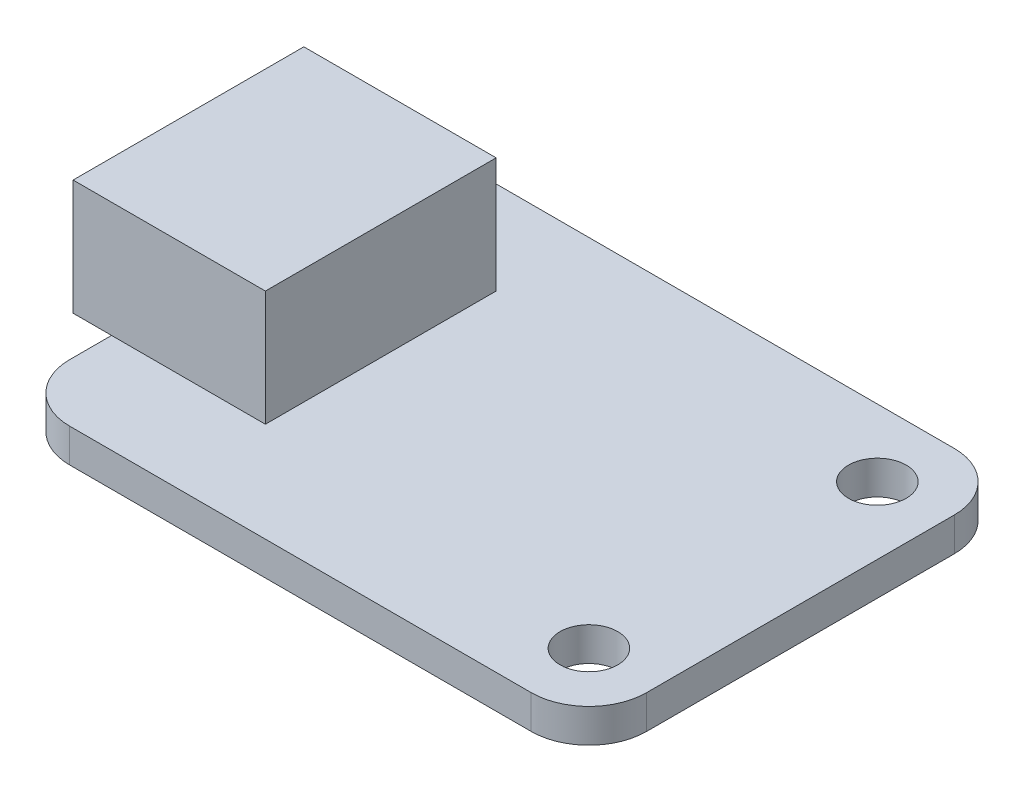
ISO-10303-21;
HEADER;
FILE_DESCRIPTION(('STEP AP214'),'2;1');
FILE_NAME('part.step','',(''),(''),'','','');
FILE_SCHEMA(('AUTOMOTIVE_DESIGN { 1 0 10303 214 1 1 1 1 }'));
ENDSEC;
DATA;
#1=APPLICATION_CONTEXT('core data for automotive mechanical design processes');
#2=APPLICATION_PROTOCOL_DEFINITION('international standard','automotive_design',2000,#1);
#3=PRODUCT_CONTEXT('',#1,'mechanical');
#4=PRODUCT('Part','Part','',(#3));
#5=PRODUCT_RELATED_PRODUCT_CATEGORY('part','',(#4));
#6=PRODUCT_DEFINITION_FORMATION('','',#4);
#7=PRODUCT_DEFINITION_CONTEXT('part definition',#1,'design');
#8=PRODUCT_DEFINITION('design','',#6,#7);
#9=PRODUCT_DEFINITION_SHAPE('','',#8);
#10=(LENGTH_UNIT() NAMED_UNIT(*) SI_UNIT(.MILLI.,.METRE.));
#11=(NAMED_UNIT(*) PLANE_ANGLE_UNIT() SI_UNIT($,.RADIAN.));
#12=(NAMED_UNIT(*) SI_UNIT($,.STERADIAN.) SOLID_ANGLE_UNIT());
#13=UNCERTAINTY_MEASURE_WITH_UNIT(LENGTH_MEASURE(1.E-05),#10,'distance_accuracy_value','');
#14=(GEOMETRIC_REPRESENTATION_CONTEXT(3) GLOBAL_UNCERTAINTY_ASSIGNED_CONTEXT((#13)) GLOBAL_UNIT_ASSIGNED_CONTEXT((#10,
#11,#12)) REPRESENTATION_CONTEXT('',''));
#15=CARTESIAN_POINT('',(0.,0.,0.));
#16=DIRECTION('',(0.,0.,1.));
#17=DIRECTION('',(1.,0.,0.));
#18=AXIS2_PLACEMENT_3D('',#15,#16,#17);
#19=CARTESIAN_POINT('',(-12.,1.75,8.));
#20=DIRECTION('',(0.,-1.,0.));
#21=DIRECTION('',(0.,0.,-1.));
#22=AXIS2_PLACEMENT_3D('',#19,#20,#21);
#23=PLANE('',#22);
#24=CARTESIAN_POINT('',(11.5,1.75,7.5));
#25=DIRECTION('',(0.,1.,0.));
#26=DIRECTION('',(0.,0.,1.));
#27=AXIS2_PLACEMENT_3D('',#24,#25,#26);
#28=CIRCLE('',#27,1.5);
#29=CARTESIAN_POINT('',(11.5,1.75,9.));
#30=VERTEX_POINT('',#29);
#31=EDGE_CURVE('E159',#30,#30,#28,.T.);
#32=ORIENTED_EDGE('',*,*,#31,.F.);
#33=EDGE_LOOP('',(#32));
#34=FACE_BOUND('',#33,.T.);
#35=CARTESIAN_POINT('',(11.5,1.75,-7.5));
#36=DIRECTION('',(0.,1.,0.));
#37=DIRECTION('',(0.,0.,1.));
#38=AXIS2_PLACEMENT_3D('',#35,#36,#37);
#39=CIRCLE('',#38,1.5);
#40=CARTESIAN_POINT('',(11.5,1.75,-6.));
#41=VERTEX_POINT('',#40);
#42=EDGE_CURVE('E168',#41,#41,#39,.T.);
#43=ORIENTED_EDGE('',*,*,#42,.F.);
#44=EDGE_LOOP('',(#43));
#45=FACE_BOUND('',#44,.T.);
#46=DIRECTION('',(-1.,0.,0.));
#47=VECTOR('',#46,1.);
#48=CARTESIAN_POINT('',(-7.,1.75,-6.17485512723608));
#49=LINE('',#48,#47);
#50=CARTESIAN_POINT('',(-7.,1.75,-6.17485512723608));
#51=VERTEX_POINT('',#50);
#52=CARTESIAN_POINT('',(-15.,1.75,-6.17485512723608));
#53=VERTEX_POINT('',#52);
#54=EDGE_CURVE('E53',#51,#53,#49,.T.);
#55=ORIENTED_EDGE('',*,*,#54,.F.);
#56=DIRECTION('',(0.,0.,-1.));
#57=VECTOR('',#56,1.);
#58=CARTESIAN_POINT('',(-7.,1.75,-6.17485512723608));
#59=LINE('',#58,#57);
#60=CARTESIAN_POINT('',(-7.,1.75,5.82514487276392));
#61=VERTEX_POINT('',#60);
#62=EDGE_CURVE('E428',#61,#51,#59,.T.);
#63=ORIENTED_EDGE('',*,*,#62,.F.);
#64=DIRECTION('',(1.,0.,0.));
#65=VECTOR('',#64,1.);
#66=CARTESIAN_POINT('',(-7.,1.75,5.82514487276392));
#67=LINE('',#66,#65);
#68=CARTESIAN_POINT('',(-15.,1.75,5.82514487276392));
#69=VERTEX_POINT('',#68);
#70=EDGE_CURVE('E11',#69,#61,#67,.T.);
#71=ORIENTED_EDGE('',*,*,#70,.F.);
#72=DIRECTION('',(0.,0.,1.));
#73=VECTOR('',#72,1.);
#74=CARTESIAN_POINT('',(-15.,1.75,-7.99999999999997));
#75=LINE('',#74,#73);
#76=CARTESIAN_POINT('',(-15.,1.75,7.99999999999998));
#77=VERTEX_POINT('',#76);
#78=EDGE_CURVE('E190',#69,#77,#75,.T.);
#79=ORIENTED_EDGE('',*,*,#78,.T.);
#80=CARTESIAN_POINT('',(-12.,1.75,8.));
#81=DIRECTION('',(0.,1.,0.));
#82=DIRECTION('',(0.,0.,-1.));
#83=AXIS2_PLACEMENT_3D('',#80,#81,#82);
#84=CIRCLE('',#83,3.);
#85=CARTESIAN_POINT('',(-12.,1.75,11.));
#86=VERTEX_POINT('',#85);
#87=EDGE_CURVE('E174',#77,#86,#84,.T.);
#88=ORIENTED_EDGE('',*,*,#87,.T.);
#89=DIRECTION('',(1.,0.,0.));
#90=VECTOR('',#89,1.);
#91=CARTESIAN_POINT('',(12.,1.75,11.));
#92=LINE('',#91,#90);
#93=CARTESIAN_POINT('',(12.,1.75,11.));
#94=VERTEX_POINT('',#93);
#95=EDGE_CURVE('E177',#86,#94,#92,.T.);
#96=ORIENTED_EDGE('',*,*,#95,.T.);
#97=CARTESIAN_POINT('',(12.,1.75,8.));
#98=DIRECTION('',(0.,1.,0.));
#99=DIRECTION('',(0.,0.,-1.));
#100=AXIS2_PLACEMENT_3D('',#97,#98,#99);
#101=CIRCLE('',#100,3.);
#102=CARTESIAN_POINT('',(15.,1.75,7.99999999999998));
#103=VERTEX_POINT('',#102);
#104=EDGE_CURVE('E180',#94,#103,#101,.T.);
#105=ORIENTED_EDGE('',*,*,#104,.T.);
#106=DIRECTION('',(0.,0.,-1.));
#107=VECTOR('',#106,1.);
#108=CARTESIAN_POINT('',(15.,1.75,-7.99999999999998));
#109=LINE('',#108,#107);
#110=CARTESIAN_POINT('',(15.,1.75,-7.99999999999998));
#111=VERTEX_POINT('',#110);
#112=EDGE_CURVE('E182',#103,#111,#109,.T.);
#113=ORIENTED_EDGE('',*,*,#112,.T.);
#114=CARTESIAN_POINT('',(12.,1.75,-8.));
#115=DIRECTION('',(0.,1.,0.));
#116=DIRECTION('',(0.,0.,-1.));
#117=AXIS2_PLACEMENT_3D('',#114,#115,#116);
#118=CIRCLE('',#117,3.);
#119=CARTESIAN_POINT('',(12.,1.75,-11.));
#120=VERTEX_POINT('',#119);
#121=EDGE_CURVE('E184',#111,#120,#118,.T.);
#122=ORIENTED_EDGE('',*,*,#121,.T.);
#123=DIRECTION('',(-1.,0.,0.));
#124=VECTOR('',#123,1.);
#125=CARTESIAN_POINT('',(12.,1.75,-11.));
#126=LINE('',#125,#124);
#127=CARTESIAN_POINT('',(-12.,1.75,-11.));
#128=VERTEX_POINT('',#127);
#129=EDGE_CURVE('E186',#120,#128,#126,.T.);
#130=ORIENTED_EDGE('',*,*,#129,.T.);
#131=CARTESIAN_POINT('',(-12.,1.75,-8.));
#132=DIRECTION('',(0.,1.,0.));
#133=DIRECTION('',(0.,0.,1.));
#134=AXIS2_PLACEMENT_3D('',#131,#132,#133);
#135=CIRCLE('',#134,3.);
#136=CARTESIAN_POINT('',(-15.,1.75,-7.99999999999998));
#137=VERTEX_POINT('',#136);
#138=EDGE_CURVE('E188',#128,#137,#135,.T.);
#139=ORIENTED_EDGE('',*,*,#138,.T.);
#140=EDGE_CURVE('E191',#137,#53,#75,.T.);
#141=ORIENTED_EDGE('',*,*,#140,.T.);
#142=EDGE_LOOP('',(#55,#63,#71,#79,#88,#96,#105,#113,#122,#130,#139,#141));
#143=FACE_BOUND('',#142,.T.);
#144=ADVANCED_FACE('F36',(#34,#45,#143),#23,.F.);
#145=CARTESIAN_POINT('',(-12.,0.,8.));
#146=DIRECTION('',(0.,-1.,0.));
#147=DIRECTION('',(0.,0.,-1.));
#148=AXIS2_PLACEMENT_3D('',#145,#146,#147);
#149=PLANE('',#148);
#150=CARTESIAN_POINT('',(11.5,0.,-7.5));
#151=DIRECTION('',(0.,1.,0.));
#152=DIRECTION('',(0.,0.,1.));
#153=AXIS2_PLACEMENT_3D('',#150,#151,#152);
#154=CIRCLE('',#153,1.5);
#155=CARTESIAN_POINT('',(11.5,0.,-6.));
#156=VERTEX_POINT('',#155);
#157=EDGE_CURVE('E166',#156,#156,#154,.T.);
#158=ORIENTED_EDGE('',*,*,#157,.T.);
#159=EDGE_LOOP('',(#158));
#160=FACE_BOUND('',#159,.T.);
#161=CARTESIAN_POINT('',(-12.,0.,8.));
#162=DIRECTION('',(0.,1.,0.));
#163=DIRECTION('',(0.,0.,-1.));
#164=AXIS2_PLACEMENT_3D('',#161,#162,#163);
#165=CIRCLE('',#164,3.);
#166=CARTESIAN_POINT('',(-15.,0.,7.99999999999998));
#167=VERTEX_POINT('',#166);
#168=CARTESIAN_POINT('',(-12.,0.,11.));
#169=VERTEX_POINT('',#168);
#170=EDGE_CURVE('E171',#167,#169,#165,.T.);
#171=ORIENTED_EDGE('',*,*,#170,.F.);
#172=DIRECTION('',(0.,0.,1.));
#173=VECTOR('',#172,1.);
#174=CARTESIAN_POINT('',(-15.,0.,-7.99999999999997));
#175=LINE('',#174,#173);
#176=CARTESIAN_POINT('',(-15.,0.,-7.99999999999998));
#177=VERTEX_POINT('',#176);
#178=EDGE_CURVE('E178',#177,#167,#175,.T.);
#179=ORIENTED_EDGE('',*,*,#178,.F.);
#180=CARTESIAN_POINT('',(-12.,0.,-8.));
#181=DIRECTION('',(0.,1.,0.));
#182=DIRECTION('',(0.,0.,1.));
#183=AXIS2_PLACEMENT_3D('',#180,#181,#182);
#184=CIRCLE('',#183,3.);
#185=CARTESIAN_POINT('',(-12.,0.,-11.));
#186=VERTEX_POINT('',#185);
#187=EDGE_CURVE('E207',#186,#177,#184,.T.);
#188=ORIENTED_EDGE('',*,*,#187,.F.);
#189=DIRECTION('',(-1.,0.,0.));
#190=VECTOR('',#189,1.);
#191=CARTESIAN_POINT('',(12.,0.,-11.));
#192=LINE('',#191,#190);
#193=CARTESIAN_POINT('',(12.,0.,-11.));
#194=VERTEX_POINT('',#193);
#195=EDGE_CURVE('E205',#194,#186,#192,.T.);
#196=ORIENTED_EDGE('',*,*,#195,.F.);
#197=CARTESIAN_POINT('',(12.,0.,-8.));
#198=DIRECTION('',(0.,1.,0.));
#199=DIRECTION('',(0.,0.,-1.));
#200=AXIS2_PLACEMENT_3D('',#197,#198,#199);
#201=CIRCLE('',#200,3.);
#202=CARTESIAN_POINT('',(15.,0.,-7.99999999999998));
#203=VERTEX_POINT('',#202);
#204=EDGE_CURVE('E203',#203,#194,#201,.T.);
#205=ORIENTED_EDGE('',*,*,#204,.F.);
#206=DIRECTION('',(0.,0.,-1.));
#207=VECTOR('',#206,1.);
#208=CARTESIAN_POINT('',(15.,0.,-7.99999999999998));
#209=LINE('',#208,#207);
#210=CARTESIAN_POINT('',(15.,0.,7.99999999999998));
#211=VERTEX_POINT('',#210);
#212=EDGE_CURVE('E201',#211,#203,#209,.T.);
#213=ORIENTED_EDGE('',*,*,#212,.F.);
#214=CARTESIAN_POINT('',(12.,0.,8.));
#215=DIRECTION('',(0.,1.,0.));
#216=DIRECTION('',(0.,0.,-1.));
#217=AXIS2_PLACEMENT_3D('',#214,#215,#216);
#218=CIRCLE('',#217,3.);
#219=CARTESIAN_POINT('',(12.,0.,11.));
#220=VERTEX_POINT('',#219);
#221=EDGE_CURVE('E199',#220,#211,#218,.T.);
#222=ORIENTED_EDGE('',*,*,#221,.F.);
#223=DIRECTION('',(1.,0.,0.));
#224=VECTOR('',#223,1.);
#225=CARTESIAN_POINT('',(12.,0.,11.));
#226=LINE('',#225,#224);
#227=EDGE_CURVE('E197',#169,#220,#226,.T.);
#228=ORIENTED_EDGE('',*,*,#227,.F.);
#229=EDGE_LOOP('',(#171,#179,#188,#196,#205,#213,#222,#228));
#230=FACE_BOUND('',#229,.T.);
#231=CARTESIAN_POINT('',(11.5,0.,7.5));
#232=DIRECTION('',(0.,1.,0.));
#233=DIRECTION('',(0.,0.,1.));
#234=AXIS2_PLACEMENT_3D('',#231,#232,#233);
#235=CIRCLE('',#234,1.5);
#236=CARTESIAN_POINT('',(11.5,0.,9.));
#237=VERTEX_POINT('',#236);
#238=EDGE_CURVE('E156',#237,#237,#235,.T.);
#239=ORIENTED_EDGE('',*,*,#238,.T.);
#240=EDGE_LOOP('',(#239));
#241=FACE_BOUND('',#240,.T.);
#242=ADVANCED_FACE('F242',(#160,#230,#241),#149,.T.);
#243=CARTESIAN_POINT('',(-12.,1.75,8.));
#244=DIRECTION('',(0.,-1.,0.));
#245=DIRECTION('',(0.,0.,-1.));
#246=AXIS2_PLACEMENT_3D('',#243,#244,#245);
#247=CYLINDRICAL_SURFACE('',#246,3.);
#248=ORIENTED_EDGE('',*,*,#170,.T.);
#249=DIRECTION('',(0.,-1.,0.));
#250=VECTOR('',#249,1.);
#251=CARTESIAN_POINT('',(-12.,1.75,11.));
#252=LINE('',#251,#250);
#253=EDGE_CURVE('E40',#86,#169,#252,.T.);
#254=ORIENTED_EDGE('',*,*,#253,.F.);
#255=ORIENTED_EDGE('',*,*,#87,.F.);
#256=DIRECTION('',(0.,-1.,0.));
#257=VECTOR('',#256,1.);
#258=CARTESIAN_POINT('',(-15.,1.75,7.99999999999998));
#259=LINE('',#258,#257);
#260=EDGE_CURVE('E193',#77,#167,#259,.T.);
#261=ORIENTED_EDGE('',*,*,#260,.T.);
#262=EDGE_LOOP('',(#248,#254,#255,#261));
#263=FACE_BOUND('',#262,.T.);
#264=ADVANCED_FACE('F38',(#263),#247,.T.);
#265=CARTESIAN_POINT('',(12.,1.75,11.));
#266=DIRECTION('',(0.,0.,-1.));
#267=DIRECTION('',(-1.,0.,0.));
#268=AXIS2_PLACEMENT_3D('',#265,#266,#267);
#269=PLANE('',#268);
#270=ORIENTED_EDGE('',*,*,#227,.T.);
#271=DIRECTION('',(0.,-1.,0.));
#272=VECTOR('',#271,1.);
#273=CARTESIAN_POINT('',(12.,1.75,11.));
#274=LINE('',#273,#272);
#275=EDGE_CURVE('E226',#94,#220,#274,.T.);
#276=ORIENTED_EDGE('',*,*,#275,.F.);
#277=ORIENTED_EDGE('',*,*,#95,.F.);
#278=ORIENTED_EDGE('',*,*,#253,.T.);
#279=EDGE_LOOP('',(#270,#276,#277,#278));
#280=FACE_BOUND('',#279,.T.);
#281=ADVANCED_FACE('F235',(#280),#269,.F.);
#282=CARTESIAN_POINT('',(12.,1.75,8.));
#283=DIRECTION('',(0.,-1.,0.));
#284=DIRECTION('',(0.,0.,-1.));
#285=AXIS2_PLACEMENT_3D('',#282,#283,#284);
#286=CYLINDRICAL_SURFACE('',#285,3.);
#287=ORIENTED_EDGE('',*,*,#221,.T.);
#288=DIRECTION('',(0.,-1.,0.));
#289=VECTOR('',#288,1.);
#290=CARTESIAN_POINT('',(15.,1.75,7.99999999999998));
#291=LINE('',#290,#289);
#292=EDGE_CURVE('E224',#103,#211,#291,.T.);
#293=ORIENTED_EDGE('',*,*,#292,.F.);
#294=ORIENTED_EDGE('',*,*,#104,.F.);
#295=ORIENTED_EDGE('',*,*,#275,.T.);
#296=EDGE_LOOP('',(#287,#293,#294,#295));
#297=FACE_BOUND('',#296,.T.);
#298=ADVANCED_FACE('F248',(#297),#286,.T.);
#299=CARTESIAN_POINT('',(15.,1.75,-7.99999999999998));
#300=DIRECTION('',(-1.,0.,0.));
#301=DIRECTION('',(0.,0.,1.));
#302=AXIS2_PLACEMENT_3D('',#299,#300,#301);
#303=PLANE('',#302);
#304=ORIENTED_EDGE('',*,*,#212,.T.);
#305=DIRECTION('',(0.,-1.,0.));
#306=VECTOR('',#305,1.);
#307=CARTESIAN_POINT('',(15.,1.75,-7.99999999999998));
#308=LINE('',#307,#306);
#309=EDGE_CURVE('E221',#111,#203,#308,.T.);
#310=ORIENTED_EDGE('',*,*,#309,.F.);
#311=ORIENTED_EDGE('',*,*,#112,.F.);
#312=ORIENTED_EDGE('',*,*,#292,.T.);
#313=EDGE_LOOP('',(#304,#310,#311,#312));
#314=FACE_BOUND('',#313,.T.);
#315=ADVANCED_FACE('F251',(#314),#303,.F.);
#316=CARTESIAN_POINT('',(12.,1.75,-8.));
#317=DIRECTION('',(0.,-1.,0.));
#318=DIRECTION('',(0.,0.,-1.));
#319=AXIS2_PLACEMENT_3D('',#316,#317,#318);
#320=CYLINDRICAL_SURFACE('',#319,3.);
#321=ORIENTED_EDGE('',*,*,#204,.T.);
#322=DIRECTION('',(0.,-1.,0.));
#323=VECTOR('',#322,1.);
#324=CARTESIAN_POINT('',(12.,1.75,-11.));
#325=LINE('',#324,#323);
#326=EDGE_CURVE('E218',#120,#194,#325,.T.);
#327=ORIENTED_EDGE('',*,*,#326,.F.);
#328=ORIENTED_EDGE('',*,*,#121,.F.);
#329=ORIENTED_EDGE('',*,*,#309,.T.);
#330=EDGE_LOOP('',(#321,#327,#328,#329));
#331=FACE_BOUND('',#330,.T.);
#332=ADVANCED_FACE('F269',(#331),#320,.T.);
#333=CARTESIAN_POINT('',(12.,1.75,-11.));
#334=DIRECTION('',(0.,0.,1.));
#335=DIRECTION('',(1.,0.,0.));
#336=AXIS2_PLACEMENT_3D('',#333,#334,#335);
#337=PLANE('',#336);
#338=ORIENTED_EDGE('',*,*,#195,.T.);
#339=DIRECTION('',(0.,-1.,0.));
#340=VECTOR('',#339,1.);
#341=CARTESIAN_POINT('',(-12.,1.75,-11.));
#342=LINE('',#341,#340);
#343=EDGE_CURVE('E215',#128,#186,#342,.T.);
#344=ORIENTED_EDGE('',*,*,#343,.F.);
#345=ORIENTED_EDGE('',*,*,#129,.F.);
#346=ORIENTED_EDGE('',*,*,#326,.T.);
#347=EDGE_LOOP('',(#338,#344,#345,#346));
#348=FACE_BOUND('',#347,.T.);
#349=ADVANCED_FACE('F266',(#348),#337,.F.);
#350=CARTESIAN_POINT('',(-12.,1.75,-8.));
#351=DIRECTION('',(0.,-1.,0.));
#352=DIRECTION('',(0.,0.,-1.));
#353=AXIS2_PLACEMENT_3D('',#350,#351,#352);
#354=CYLINDRICAL_SURFACE('',#353,3.);
#355=ORIENTED_EDGE('',*,*,#187,.T.);
#356=DIRECTION('',(0.,-1.,0.));
#357=VECTOR('',#356,1.);
#358=CARTESIAN_POINT('',(-15.,1.75,-7.99999999999998));
#359=LINE('',#358,#357);
#360=EDGE_CURVE('E212',#137,#177,#359,.T.);
#361=ORIENTED_EDGE('',*,*,#360,.F.);
#362=ORIENTED_EDGE('',*,*,#138,.F.);
#363=ORIENTED_EDGE('',*,*,#343,.T.);
#364=EDGE_LOOP('',(#355,#361,#362,#363));
#365=FACE_BOUND('',#364,.T.);
#366=ADVANCED_FACE('F262',(#365),#354,.T.);
#367=CARTESIAN_POINT('',(-15.,1.75,-7.99999999999997));
#368=DIRECTION('',(1.,0.,0.));
#369=DIRECTION('',(0.,0.,-1.));
#370=AXIS2_PLACEMENT_3D('',#367,#368,#369);
#371=PLANE('',#370);
#372=ORIENTED_EDGE('',*,*,#178,.T.);
#373=ORIENTED_EDGE('',*,*,#260,.F.);
#374=ORIENTED_EDGE('',*,*,#78,.F.);
#375=EDGE_CURVE('E194',#53,#69,#75,.T.);
#376=ORIENTED_EDGE('',*,*,#375,.F.);
#377=ORIENTED_EDGE('',*,*,#140,.F.);
#378=ORIENTED_EDGE('',*,*,#360,.T.);
#379=EDGE_LOOP('',(#372,#373,#374,#376,#377,#378));
#380=FACE_BOUND('',#379,.T.);
#381=ADVANCED_FACE('F257',(#380),#371,.F.);
#382=CARTESIAN_POINT('',(11.5,1.75,-7.5));
#383=DIRECTION('',(0.,-1.,0.));
#384=DIRECTION('',(0.,0.,-1.));
#385=AXIS2_PLACEMENT_3D('',#382,#383,#384);
#386=CYLINDRICAL_SURFACE('',#385,1.5);
#387=ORIENTED_EDGE('',*,*,#42,.T.);
#388=EDGE_LOOP('',(#387));
#389=FACE_BOUND('',#388,.T.);
#390=ORIENTED_EDGE('',*,*,#157,.F.);
#391=EDGE_LOOP('',(#390));
#392=FACE_BOUND('',#391,.T.);
#393=ADVANCED_FACE('F289',(#389,#392),#386,.F.);
#394=CARTESIAN_POINT('',(11.5,1.75,7.5));
#395=DIRECTION('',(0.,-1.,0.));
#396=DIRECTION('',(0.,0.,-1.));
#397=AXIS2_PLACEMENT_3D('',#394,#395,#396);
#398=CYLINDRICAL_SURFACE('',#397,1.5);
#399=ORIENTED_EDGE('',*,*,#31,.T.);
#400=EDGE_LOOP('',(#399));
#401=FACE_BOUND('',#400,.T.);
#402=ORIENTED_EDGE('',*,*,#238,.F.);
#403=EDGE_LOOP('',(#402));
#404=FACE_BOUND('',#403,.T.);
#405=ADVANCED_FACE('F310',(#401,#404),#398,.F.);
#406=CARTESIAN_POINT('',(-17.,7.75,-6.17485512723608));
#407=DIRECTION('',(1.,0.,0.));
#408=DIRECTION('',(0.,0.,-1.));
#409=AXIS2_PLACEMENT_3D('',#406,#407,#408);
#410=PLANE('',#409);
#411=DIRECTION('',(0.,0.,1.));
#412=VECTOR('',#411,1.);
#413=CARTESIAN_POINT('',(-17.,1.75,-6.17485512723608));
#414=LINE('',#413,#412);
#415=CARTESIAN_POINT('',(-17.,1.75,-6.17485512723608));
#416=VERTEX_POINT('',#415);
#417=CARTESIAN_POINT('',(-17.,1.75,5.82514487276392));
#418=VERTEX_POINT('',#417);
#419=EDGE_CURVE('E155',#416,#418,#414,.T.);
#420=ORIENTED_EDGE('',*,*,#419,.T.);
#421=DIRECTION('',(0.,-1.,0.));
#422=VECTOR('',#421,1.);
#423=CARTESIAN_POINT('',(-17.,7.75,5.82514487276392));
#424=LINE('',#423,#422);
#425=CARTESIAN_POINT('',(-17.,7.75,5.82514487276392));
#426=VERTEX_POINT('',#425);
#427=EDGE_CURVE('E136',#426,#418,#424,.T.);
#428=ORIENTED_EDGE('',*,*,#427,.F.);
#429=DIRECTION('',(0.,0.,1.));
#430=VECTOR('',#429,1.);
#431=CARTESIAN_POINT('',(-17.,7.75,-6.17485512723608));
#432=LINE('',#431,#430);
#433=CARTESIAN_POINT('',(-17.,7.75,-6.17485512723608));
#434=VERTEX_POINT('',#433);
#435=EDGE_CURVE('E143',#434,#426,#432,.T.);
#436=ORIENTED_EDGE('',*,*,#435,.F.);
#437=DIRECTION('',(0.,-1.,0.));
#438=VECTOR('',#437,1.);
#439=CARTESIAN_POINT('',(-17.,7.75,-6.17485512723608));
#440=LINE('',#439,#438);
#441=EDGE_CURVE('E434',#434,#416,#440,.T.);
#442=ORIENTED_EDGE('',*,*,#441,.T.);
#443=EDGE_LOOP('',(#420,#428,#436,#442));
#444=FACE_BOUND('',#443,.T.);
#445=ADVANCED_FACE('F153',(#444),#410,.F.);
#446=CARTESIAN_POINT('',(-7.,7.75,5.82514487276392));
#447=DIRECTION('',(0.,0.,-1.));
#448=DIRECTION('',(-1.,0.,0.));
#449=AXIS2_PLACEMENT_3D('',#446,#447,#448);
#450=PLANE('',#449);
#451=EDGE_CURVE('E46',#418,#69,#67,.T.);
#452=ORIENTED_EDGE('',*,*,#451,.T.);
#453=ORIENTED_EDGE('',*,*,#70,.T.);
#454=DIRECTION('',(0.,-1.,0.));
#455=VECTOR('',#454,1.);
#456=CARTESIAN_POINT('',(-7.,7.75,5.82514487276392));
#457=LINE('',#456,#455);
#458=CARTESIAN_POINT('',(-7.,7.75,5.82514487276392));
#459=VERTEX_POINT('',#458);
#460=EDGE_CURVE('E139',#459,#61,#457,.T.);
#461=ORIENTED_EDGE('',*,*,#460,.F.);
#462=DIRECTION('',(1.,0.,0.));
#463=VECTOR('',#462,1.);
#464=CARTESIAN_POINT('',(-7.,7.75,5.82514487276392));
#465=LINE('',#464,#463);
#466=EDGE_CURVE('E131',#426,#459,#465,.T.);
#467=ORIENTED_EDGE('',*,*,#466,.F.);
#468=ORIENTED_EDGE('',*,*,#427,.T.);
#469=EDGE_LOOP('',(#452,#453,#461,#467,#468));
#470=FACE_BOUND('',#469,.T.);
#471=ADVANCED_FACE('F134',(#470),#450,.F.);
#472=CARTESIAN_POINT('',(-7.,7.75,-6.17485512723608));
#473=DIRECTION('',(-1.,0.,0.));
#474=DIRECTION('',(0.,0.,1.));
#475=AXIS2_PLACEMENT_3D('',#472,#473,#474);
#476=PLANE('',#475);
#477=ORIENTED_EDGE('',*,*,#62,.T.);
#478=DIRECTION('',(0.,-1.,0.));
#479=VECTOR('',#478,1.);
#480=CARTESIAN_POINT('',(-7.,7.75,-6.17485512723608));
#481=LINE('',#480,#479);
#482=CARTESIAN_POINT('',(-7.,7.75,-6.17485512723608));
#483=VERTEX_POINT('',#482);
#484=EDGE_CURVE('E161',#483,#51,#481,.T.);
#485=ORIENTED_EDGE('',*,*,#484,.F.);
#486=DIRECTION('',(0.,0.,-1.));
#487=VECTOR('',#486,1.);
#488=CARTESIAN_POINT('',(-7.,7.75,-6.17485512723608));
#489=LINE('',#488,#487);
#490=EDGE_CURVE('E142',#459,#483,#489,.T.);
#491=ORIENTED_EDGE('',*,*,#490,.F.);
#492=ORIENTED_EDGE('',*,*,#460,.T.);
#493=EDGE_LOOP('',(#477,#485,#491,#492));
#494=FACE_BOUND('',#493,.T.);
#495=ADVANCED_FACE('F328',(#494),#476,.F.);
#496=CARTESIAN_POINT('',(-7.,7.75,-6.17485512723608));
#497=DIRECTION('',(0.,0.,1.));
#498=DIRECTION('',(1.,0.,0.));
#499=AXIS2_PLACEMENT_3D('',#496,#497,#498);
#500=PLANE('',#499);
#501=ORIENTED_EDGE('',*,*,#54,.T.);
#502=EDGE_CURVE('E427',#53,#416,#49,.T.);
#503=ORIENTED_EDGE('',*,*,#502,.T.);
#504=ORIENTED_EDGE('',*,*,#441,.F.);
#505=DIRECTION('',(-1.,0.,0.));
#506=VECTOR('',#505,1.);
#507=CARTESIAN_POINT('',(-7.,7.75,-6.17485512723608));
#508=LINE('',#507,#506);
#509=EDGE_CURVE('E148',#483,#434,#508,.T.);
#510=ORIENTED_EDGE('',*,*,#509,.F.);
#511=ORIENTED_EDGE('',*,*,#484,.T.);
#512=EDGE_LOOP('',(#501,#503,#504,#510,#511));
#513=FACE_BOUND('',#512,.T.);
#514=ADVANCED_FACE('F335',(#513),#500,.F.);
#515=CARTESIAN_POINT('',(0.,7.75,0.));
#516=DIRECTION('',(0.,-1.,0.));
#517=DIRECTION('',(0.,0.,-1.));
#518=AXIS2_PLACEMENT_3D('',#515,#516,#517);
#519=PLANE('',#518);
#520=ORIENTED_EDGE('',*,*,#435,.T.);
#521=ORIENTED_EDGE('',*,*,#466,.T.);
#522=ORIENTED_EDGE('',*,*,#490,.T.);
#523=ORIENTED_EDGE('',*,*,#509,.T.);
#524=EDGE_LOOP('',(#520,#521,#522,#523));
#525=FACE_BOUND('',#524,.T.);
#526=ADVANCED_FACE('F146',(#525),#519,.F.);
#527=CARTESIAN_POINT('',(0.,1.75,0.));
#528=DIRECTION('',(0.,-1.,0.));
#529=DIRECTION('',(0.,0.,-1.));
#530=AXIS2_PLACEMENT_3D('',#527,#528,#529);
#531=PLANE('',#530);
#532=ORIENTED_EDGE('',*,*,#502,.F.);
#533=ORIENTED_EDGE('',*,*,#375,.T.);
#534=ORIENTED_EDGE('',*,*,#451,.F.);
#535=ORIENTED_EDGE('',*,*,#419,.F.);
#536=EDGE_LOOP('',(#532,#533,#534,#535));
#537=FACE_BOUND('',#536,.T.);
#538=ADVANCED_FACE('F350',(#537),#531,.T.);
#539=CLOSED_SHELL('',(#144,#242,#264,#281,#298,#315,#332,#349,#366,#381,#393,#405,#445,#471,
#495,#514,#526,#538));
#540=MANIFOLD_SOLID_BREP('B2',#539);
#541=ADVANCED_BREP_SHAPE_REPRESENTATION('',(#18,#540),#14);
#542=SHAPE_DEFINITION_REPRESENTATION(#9,#541);
ENDSEC;
END-ISO-10303-21;
